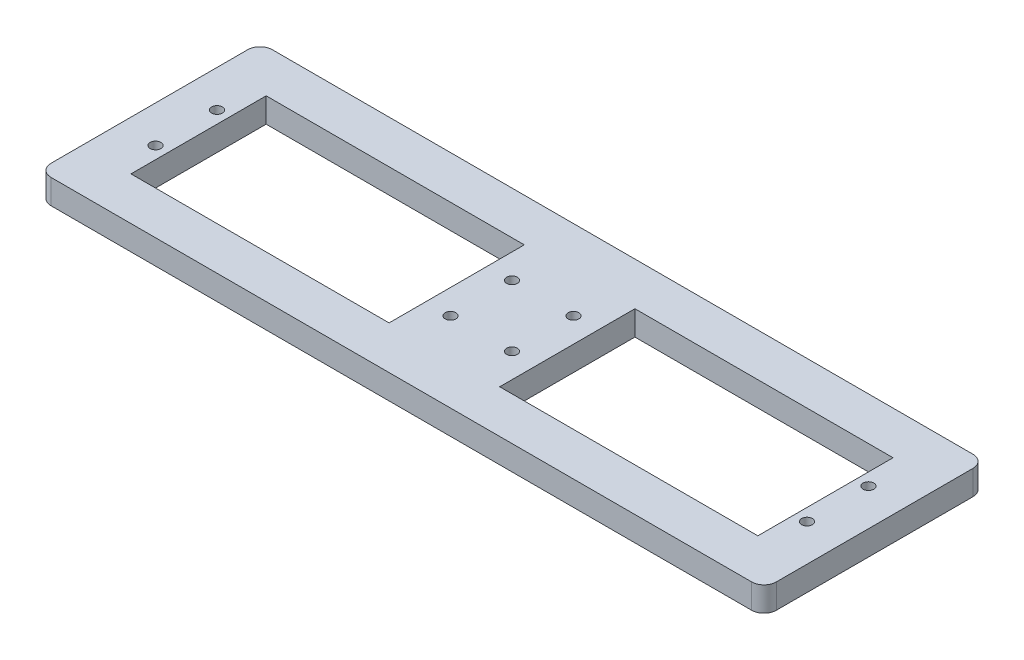
ISO-10303-21;
HEADER;
FILE_DESCRIPTION(('STEP AP214'),'2;1');
FILE_NAME('part.step','',(''),(''),'','','');
FILE_SCHEMA(('AUTOMOTIVE_DESIGN { 1 0 10303 214 1 1 1 1 }'));
ENDSEC;
DATA;
#1=APPLICATION_CONTEXT('core data for automotive mechanical design processes');
#2=APPLICATION_PROTOCOL_DEFINITION('international standard','automotive_design',2000,#1);
#3=PRODUCT_CONTEXT('',#1,'mechanical');
#4=PRODUCT('Part','Part','',(#3));
#5=PRODUCT_RELATED_PRODUCT_CATEGORY('part','',(#4));
#6=PRODUCT_DEFINITION_FORMATION('','',#4);
#7=PRODUCT_DEFINITION_CONTEXT('part definition',#1,'design');
#8=PRODUCT_DEFINITION('design','',#6,#7);
#9=PRODUCT_DEFINITION_SHAPE('','',#8);
#10=(LENGTH_UNIT() NAMED_UNIT(*) SI_UNIT(.MILLI.,.METRE.));
#11=(NAMED_UNIT(*) PLANE_ANGLE_UNIT() SI_UNIT($,.RADIAN.));
#12=(NAMED_UNIT(*) SI_UNIT($,.STERADIAN.) SOLID_ANGLE_UNIT());
#13=UNCERTAINTY_MEASURE_WITH_UNIT(LENGTH_MEASURE(1.E-05),#10,'distance_accuracy_value','');
#14=(GEOMETRIC_REPRESENTATION_CONTEXT(3) GLOBAL_UNCERTAINTY_ASSIGNED_CONTEXT((#13)) GLOBAL_UNIT_ASSIGNED_CONTEXT((#10,
#11,#12)) REPRESENTATION_CONTEXT('',''));
#15=CARTESIAN_POINT('',(0.,0.,0.));
#16=DIRECTION('',(0.,0.,1.));
#17=DIRECTION('',(1.,0.,0.));
#18=AXIS2_PLACEMENT_3D('',#15,#16,#17);
#19=CARTESIAN_POINT('',(57.,4.,16.));
#20=DIRECTION('',(0.,1.,0.));
#21=DIRECTION('',(0.,0.,1.));
#22=AXIS2_PLACEMENT_3D('',#19,#20,#21);
#23=PLANE('',#22);
#24=CARTESIAN_POINT('',(5.00000000000002,4.,4.99999999999999));
#25=DIRECTION('',(0.,1.,0.));
#26=DIRECTION('',(0.,0.,1.));
#27=AXIS2_PLACEMENT_3D('',#24,#25,#26);
#28=CIRCLE('',#27,0.875);
#29=CARTESIAN_POINT('',(5.00000000000002,4.,5.87499999999999));
#30=VERTEX_POINT('',#29);
#31=EDGE_CURVE('E464',#30,#30,#28,.F.);
#32=ORIENTED_EDGE('',*,*,#31,.T.);
#33=EDGE_LOOP('',(#32));
#34=FACE_BOUND('',#33,.T.);
#35=CARTESIAN_POINT('',(5.00000000000002,4.,-5.00000000000001));
#36=DIRECTION('',(0.,1.,0.));
#37=DIRECTION('',(0.,0.,1.));
#38=AXIS2_PLACEMENT_3D('',#35,#36,#37);
#39=CIRCLE('',#38,0.875);
#40=CARTESIAN_POINT('',(5.00000000000002,4.,-4.12500000000001));
#41=VERTEX_POINT('',#40);
#42=EDGE_CURVE('E469',#41,#41,#39,.F.);
#43=ORIENTED_EDGE('',*,*,#42,.T.);
#44=EDGE_LOOP('',(#43));
#45=FACE_BOUND('',#44,.T.);
#46=CARTESIAN_POINT('',(53.,4.,4.99999999999999));
#47=DIRECTION('',(0.,1.,0.));
#48=DIRECTION('',(0.,0.,1.));
#49=AXIS2_PLACEMENT_3D('',#46,#47,#48);
#50=CIRCLE('',#49,0.874999999999998);
#51=CARTESIAN_POINT('',(53.,4.,5.87499999999999));
#52=VERTEX_POINT('',#51);
#53=EDGE_CURVE('E493',#52,#52,#50,.F.);
#54=ORIENTED_EDGE('',*,*,#53,.T.);
#55=EDGE_LOOP('',(#54));
#56=FACE_BOUND('',#55,.T.);
#57=CARTESIAN_POINT('',(53.,4.,-5.00000000000001));
#58=DIRECTION('',(0.,1.,0.));
#59=DIRECTION('',(0.,0.,1.));
#60=AXIS2_PLACEMENT_3D('',#57,#58,#59);
#61=CIRCLE('',#60,0.874999999999998);
#62=CARTESIAN_POINT('',(53.,4.,-4.12500000000001));
#63=VERTEX_POINT('',#62);
#64=EDGE_CURVE('E486',#63,#63,#61,.F.);
#65=ORIENTED_EDGE('',*,*,#64,.T.);
#66=EDGE_LOOP('',(#65));
#67=FACE_BOUND('',#66,.T.);
#68=CARTESIAN_POINT('',(-5.00000000000002,4.,4.99999999999999));
#69=DIRECTION('',(0.,1.,0.));
#70=DIRECTION('',(0.,0.,1.));
#71=AXIS2_PLACEMENT_3D('',#68,#69,#70);
#72=CIRCLE('',#71,0.875);
#73=CARTESIAN_POINT('',(-5.00000000000002,4.,5.87499999999999));
#74=VERTEX_POINT('',#73);
#75=EDGE_CURVE('E509',#74,#74,#72,.T.);
#76=ORIENTED_EDGE('',*,*,#75,.F.);
#77=EDGE_LOOP('',(#76));
#78=FACE_BOUND('',#77,.T.);
#79=CARTESIAN_POINT('',(-5.00000000000002,4.,-5.00000000000001));
#80=DIRECTION('',(0.,1.,0.));
#81=DIRECTION('',(0.,0.,1.));
#82=AXIS2_PLACEMENT_3D('',#79,#80,#81);
#83=CIRCLE('',#82,0.875);
#84=CARTESIAN_POINT('',(-5.00000000000002,4.,-4.12500000000001));
#85=VERTEX_POINT('',#84);
#86=EDGE_CURVE('E502',#85,#85,#83,.T.);
#87=ORIENTED_EDGE('',*,*,#86,.F.);
#88=EDGE_LOOP('',(#87));
#89=FACE_BOUND('',#88,.T.);
#90=CARTESIAN_POINT('',(-53.,4.,4.99999999999999));
#91=DIRECTION('',(0.,1.,0.));
#92=DIRECTION('',(0.,0.,1.));
#93=AXIS2_PLACEMENT_3D('',#90,#91,#92);
#94=CIRCLE('',#93,0.874999999999998);
#95=CARTESIAN_POINT('',(-53.,4.,5.87499999999999));
#96=VERTEX_POINT('',#95);
#97=EDGE_CURVE('E190',#96,#96,#94,.T.);
#98=ORIENTED_EDGE('',*,*,#97,.F.);
#99=EDGE_LOOP('',(#98));
#100=FACE_BOUND('',#99,.T.);
#101=CARTESIAN_POINT('',(-53.,4.,-5.00000000000001));
#102=DIRECTION('',(0.,1.,0.));
#103=DIRECTION('',(0.,0.,1.));
#104=AXIS2_PLACEMENT_3D('',#101,#102,#103);
#105=CIRCLE('',#104,0.874999999999998);
#106=CARTESIAN_POINT('',(-53.,4.,-4.12500000000001));
#107=VERTEX_POINT('',#106);
#108=EDGE_CURVE('E518',#107,#107,#105,.T.);
#109=ORIENTED_EDGE('',*,*,#108,.F.);
#110=EDGE_LOOP('',(#109));
#111=FACE_BOUND('',#110,.T.);
#112=CARTESIAN_POINT('',(57.,4.,16.));
#113=DIRECTION('',(0.,1.,0.));
#114=DIRECTION('',(0.,0.,1.));
#115=AXIS2_PLACEMENT_3D('',#112,#113,#114);
#116=CIRCLE('',#115,2.);
#117=CARTESIAN_POINT('',(57.,4.,18.));
#118=VERTEX_POINT('',#117);
#119=CARTESIAN_POINT('',(59.,4.,16.));
#120=VERTEX_POINT('',#119);
#121=EDGE_CURVE('E249',#118,#120,#116,.T.);
#122=ORIENTED_EDGE('',*,*,#121,.T.);
#123=DIRECTION('',(0.,0.,-1.));
#124=VECTOR('',#123,1.);
#125=CARTESIAN_POINT('',(59.,4.,-16.));
#126=LINE('',#125,#124);
#127=CARTESIAN_POINT('',(59.,4.,-16.));
#128=VERTEX_POINT('',#127);
#129=EDGE_CURVE('E253',#120,#128,#126,.T.);
#130=ORIENTED_EDGE('',*,*,#129,.T.);
#131=CARTESIAN_POINT('',(57.,4.,-16.));
#132=DIRECTION('',(0.,1.,0.));
#133=DIRECTION('',(0.,0.,-1.));
#134=AXIS2_PLACEMENT_3D('',#131,#132,#133);
#135=CIRCLE('',#134,2.);
#136=CARTESIAN_POINT('',(57.,4.,-18.));
#137=VERTEX_POINT('',#136);
#138=EDGE_CURVE('E257',#128,#137,#135,.T.);
#139=ORIENTED_EDGE('',*,*,#138,.T.);
#140=DIRECTION('',(-1.,0.,0.));
#141=VECTOR('',#140,1.);
#142=CARTESIAN_POINT('',(-57.,4.,-18.));
#143=LINE('',#142,#141);
#144=CARTESIAN_POINT('',(-57.,4.,-18.));
#145=VERTEX_POINT('',#144);
#146=EDGE_CURVE('E260',#137,#145,#143,.T.);
#147=ORIENTED_EDGE('',*,*,#146,.T.);
#148=CARTESIAN_POINT('',(-57.,4.,-16.));
#149=DIRECTION('',(0.,1.,0.));
#150=DIRECTION('',(0.,0.,1.));
#151=AXIS2_PLACEMENT_3D('',#148,#149,#150);
#152=CIRCLE('',#151,2.);
#153=CARTESIAN_POINT('',(-59.,4.,-16.));
#154=VERTEX_POINT('',#153);
#155=EDGE_CURVE('E263',#145,#154,#152,.T.);
#156=ORIENTED_EDGE('',*,*,#155,.T.);
#157=DIRECTION('',(0.,0.,1.));
#158=VECTOR('',#157,1.);
#159=CARTESIAN_POINT('',(-59.,4.,-16.));
#160=LINE('',#159,#158);
#161=CARTESIAN_POINT('',(-59.,4.,16.));
#162=VERTEX_POINT('',#161);
#163=EDGE_CURVE('E266',#154,#162,#160,.T.);
#164=ORIENTED_EDGE('',*,*,#163,.T.);
#165=CARTESIAN_POINT('',(-57.,4.,16.));
#166=DIRECTION('',(0.,1.,0.));
#167=DIRECTION('',(0.,0.,1.));
#168=AXIS2_PLACEMENT_3D('',#165,#166,#167);
#169=CIRCLE('',#168,2.);
#170=CARTESIAN_POINT('',(-57.,4.,18.));
#171=VERTEX_POINT('',#170);
#172=EDGE_CURVE('E269',#162,#171,#169,.T.);
#173=ORIENTED_EDGE('',*,*,#172,.T.);
#174=DIRECTION('',(1.,0.,0.));
#175=VECTOR('',#174,1.);
#176=CARTESIAN_POINT('',(-57.,4.,18.));
#177=LINE('',#176,#175);
#178=EDGE_CURVE('E272',#171,#118,#177,.T.);
#179=ORIENTED_EDGE('',*,*,#178,.T.);
#180=EDGE_LOOP('',(#122,#130,#139,#147,#156,#164,#173,#179));
#181=FACE_BOUND('',#180,.T.);
#182=DIRECTION('',(-1.,0.,0.));
#183=VECTOR('',#182,1.);
#184=CARTESIAN_POINT('',(-51.,4.,-11.));
#185=LINE('',#184,#183);
#186=CARTESIAN_POINT('',(-9.00000000000001,4.,-11.));
#187=VERTEX_POINT('',#186);
#188=CARTESIAN_POINT('',(-51.,4.,-11.));
#189=VERTEX_POINT('',#188);
#190=EDGE_CURVE('E209',#187,#189,#185,.T.);
#191=ORIENTED_EDGE('',*,*,#190,.F.);
#192=DIRECTION('',(0.,0.,-1.));
#193=VECTOR('',#192,1.);
#194=CARTESIAN_POINT('',(-9.00000000000001,4.,-11.));
#195=LINE('',#194,#193);
#196=CARTESIAN_POINT('',(-9.00000000000001,4.,11.));
#197=VERTEX_POINT('',#196);
#198=EDGE_CURVE('E206',#197,#187,#195,.T.);
#199=ORIENTED_EDGE('',*,*,#198,.F.);
#200=DIRECTION('',(1.,0.,0.));
#201=VECTOR('',#200,1.);
#202=CARTESIAN_POINT('',(-51.,4.,11.));
#203=LINE('',#202,#201);
#204=CARTESIAN_POINT('',(-51.,4.,11.));
#205=VERTEX_POINT('',#204);
#206=EDGE_CURVE('E217',#205,#197,#203,.T.);
#207=ORIENTED_EDGE('',*,*,#206,.F.);
#208=DIRECTION('',(0.,0.,1.));
#209=VECTOR('',#208,1.);
#210=CARTESIAN_POINT('',(-51.,4.,-11.));
#211=LINE('',#210,#209);
#212=EDGE_CURVE('E213',#189,#205,#211,.T.);
#213=ORIENTED_EDGE('',*,*,#212,.F.);
#214=EDGE_LOOP('',(#191,#199,#207,#213));
#215=FACE_BOUND('',#214,.T.);
#216=DIRECTION('',(-1.,0.,0.));
#217=VECTOR('',#216,1.);
#218=CARTESIAN_POINT('',(51.,4.,-11.));
#219=LINE('',#218,#217);
#220=CARTESIAN_POINT('',(51.,4.,-11.));
#221=VERTEX_POINT('',#220);
#222=CARTESIAN_POINT('',(9.00000000000002,4.,-11.));
#223=VERTEX_POINT('',#222);
#224=EDGE_CURVE('E165',#221,#223,#219,.T.);
#225=ORIENTED_EDGE('',*,*,#224,.F.);
#226=DIRECTION('',(0.,0.,-1.));
#227=VECTOR('',#226,1.);
#228=CARTESIAN_POINT('',(51.,4.,-11.));
#229=LINE('',#228,#227);
#230=CARTESIAN_POINT('',(51.,4.,11.));
#231=VERTEX_POINT('',#230);
#232=EDGE_CURVE('E156',#231,#221,#229,.T.);
#233=ORIENTED_EDGE('',*,*,#232,.F.);
#234=DIRECTION('',(1.,0.,0.));
#235=VECTOR('',#234,1.);
#236=CARTESIAN_POINT('',(51.,4.,11.));
#237=LINE('',#236,#235);
#238=CARTESIAN_POINT('',(9.00000000000003,4.,11.));
#239=VERTEX_POINT('',#238);
#240=EDGE_CURVE('E182',#239,#231,#237,.T.);
#241=ORIENTED_EDGE('',*,*,#240,.F.);
#242=DIRECTION('',(0.,0.,1.));
#243=VECTOR('',#242,1.);
#244=CARTESIAN_POINT('',(9.00000000000002,4.,-11.));
#245=LINE('',#244,#243);
#246=EDGE_CURVE('E178',#223,#239,#245,.T.);
#247=ORIENTED_EDGE('',*,*,#246,.F.);
#248=EDGE_LOOP('',(#225,#233,#241,#247));
#249=FACE_BOUND('',#248,.T.);
#250=ADVANCED_FACE('F42',(#34,#45,#56,#67,#78,#89,#100,#111,#181,#215,#249),#23,.T.);
#251=CARTESIAN_POINT('',(57.,0.,16.));
#252=DIRECTION('',(0.,1.,0.));
#253=DIRECTION('',(0.,0.,1.));
#254=AXIS2_PLACEMENT_3D('',#251,#252,#253);
#255=PLANE('',#254);
#256=CARTESIAN_POINT('',(5.00000000000002,0.,4.99999999999999));
#257=DIRECTION('',(0.,1.,0.));
#258=DIRECTION('',(0.,0.,-1.));
#259=AXIS2_PLACEMENT_3D('',#256,#257,#258);
#260=CIRCLE('',#259,0.875);
#261=CARTESIAN_POINT('',(5.00000000000002,0.,4.12499999999999));
#262=VERTEX_POINT('',#261);
#263=EDGE_CURVE('E467',#262,#262,#260,.T.);
#264=ORIENTED_EDGE('',*,*,#263,.T.);
#265=EDGE_LOOP('',(#264));
#266=FACE_BOUND('',#265,.T.);
#267=CARTESIAN_POINT('',(5.00000000000002,0.,-5.00000000000001));
#268=DIRECTION('',(0.,1.,0.));
#269=DIRECTION('',(0.,0.,-1.));
#270=AXIS2_PLACEMENT_3D('',#267,#268,#269);
#271=CIRCLE('',#270,0.875);
#272=CARTESIAN_POINT('',(5.00000000000002,0.,-5.87500000000001));
#273=VERTEX_POINT('',#272);
#274=EDGE_CURVE('E470',#273,#273,#271,.T.);
#275=ORIENTED_EDGE('',*,*,#274,.T.);
#276=EDGE_LOOP('',(#275));
#277=FACE_BOUND('',#276,.T.);
#278=CARTESIAN_POINT('',(53.,0.,4.99999999999999));
#279=DIRECTION('',(0.,1.,0.));
#280=DIRECTION('',(0.,0.,-1.));
#281=AXIS2_PLACEMENT_3D('',#278,#279,#280);
#282=CIRCLE('',#281,0.874999999999998);
#283=CARTESIAN_POINT('',(53.,0.,4.12499999999999));
#284=VERTEX_POINT('',#283);
#285=EDGE_CURVE('E482',#284,#284,#282,.T.);
#286=ORIENTED_EDGE('',*,*,#285,.T.);
#287=EDGE_LOOP('',(#286));
#288=FACE_BOUND('',#287,.T.);
#289=CARTESIAN_POINT('',(53.,0.,-5.00000000000001));
#290=DIRECTION('',(0.,1.,0.));
#291=DIRECTION('',(0.,0.,-1.));
#292=AXIS2_PLACEMENT_3D('',#289,#290,#291);
#293=CIRCLE('',#292,0.874999999999998);
#294=CARTESIAN_POINT('',(53.,0.,-5.87500000000001));
#295=VERTEX_POINT('',#294);
#296=EDGE_CURVE('E481',#295,#295,#293,.T.);
#297=ORIENTED_EDGE('',*,*,#296,.T.);
#298=EDGE_LOOP('',(#297));
#299=FACE_BOUND('',#298,.T.);
#300=CARTESIAN_POINT('',(-5.00000000000002,0.,4.99999999999999));
#301=DIRECTION('',(0.,-1.,0.));
#302=DIRECTION('',(0.,0.,-1.));
#303=AXIS2_PLACEMENT_3D('',#300,#301,#302);
#304=CIRCLE('',#303,0.875);
#305=CARTESIAN_POINT('',(-5.00000000000002,0.,4.12499999999999));
#306=VERTEX_POINT('',#305);
#307=EDGE_CURVE('E498',#306,#306,#304,.T.);
#308=ORIENTED_EDGE('',*,*,#307,.F.);
#309=EDGE_LOOP('',(#308));
#310=FACE_BOUND('',#309,.T.);
#311=CARTESIAN_POINT('',(-5.00000000000002,0.,-5.00000000000001));
#312=DIRECTION('',(0.,-1.,0.));
#313=DIRECTION('',(0.,0.,-1.));
#314=AXIS2_PLACEMENT_3D('',#311,#312,#313);
#315=CIRCLE('',#314,0.875);
#316=CARTESIAN_POINT('',(-5.00000000000002,0.,-5.87500000000001));
#317=VERTEX_POINT('',#316);
#318=EDGE_CURVE('E497',#317,#317,#315,.T.);
#319=ORIENTED_EDGE('',*,*,#318,.F.);
#320=EDGE_LOOP('',(#319));
#321=FACE_BOUND('',#320,.T.);
#322=CARTESIAN_POINT('',(-53.,0.,4.99999999999999));
#323=DIRECTION('',(0.,-1.,0.));
#324=DIRECTION('',(0.,0.,-1.));
#325=AXIS2_PLACEMENT_3D('',#322,#323,#324);
#326=CIRCLE('',#325,0.874999999999998);
#327=CARTESIAN_POINT('',(-53.,0.,4.12499999999999));
#328=VERTEX_POINT('',#327);
#329=EDGE_CURVE('E514',#328,#328,#326,.T.);
#330=ORIENTED_EDGE('',*,*,#329,.F.);
#331=EDGE_LOOP('',(#330));
#332=FACE_BOUND('',#331,.T.);
#333=CARTESIAN_POINT('',(-53.,0.,-5.00000000000001));
#334=DIRECTION('',(0.,-1.,0.));
#335=DIRECTION('',(0.,0.,-1.));
#336=AXIS2_PLACEMENT_3D('',#333,#334,#335);
#337=CIRCLE('',#336,0.874999999999998);
#338=CARTESIAN_POINT('',(-53.,0.,-5.87500000000001));
#339=VERTEX_POINT('',#338);
#340=EDGE_CURVE('E513',#339,#339,#337,.T.);
#341=ORIENTED_EDGE('',*,*,#340,.F.);
#342=EDGE_LOOP('',(#341));
#343=FACE_BOUND('',#342,.T.);
#344=DIRECTION('',(0.,0.,-1.));
#345=VECTOR('',#344,1.);
#346=CARTESIAN_POINT('',(-9.00000000000001,0.,-11.));
#347=LINE('',#346,#345);
#348=CARTESIAN_POINT('',(-9.00000000000001,0.,11.));
#349=VERTEX_POINT('',#348);
#350=CARTESIAN_POINT('',(-9.00000000000001,0.,-11.));
#351=VERTEX_POINT('',#350);
#352=EDGE_CURVE('E174',#349,#351,#347,.T.);
#353=ORIENTED_EDGE('',*,*,#352,.T.);
#354=DIRECTION('',(-1.,0.,0.));
#355=VECTOR('',#354,1.);
#356=CARTESIAN_POINT('',(-51.,0.,-11.));
#357=LINE('',#356,#355);
#358=CARTESIAN_POINT('',(-51.,0.,-11.));
#359=VERTEX_POINT('',#358);
#360=EDGE_CURVE('E224',#351,#359,#357,.T.);
#361=ORIENTED_EDGE('',*,*,#360,.T.);
#362=DIRECTION('',(0.,0.,1.));
#363=VECTOR('',#362,1.);
#364=CARTESIAN_POINT('',(-51.,0.,-11.));
#365=LINE('',#364,#363);
#366=CARTESIAN_POINT('',(-51.,0.,11.));
#367=VERTEX_POINT('',#366);
#368=EDGE_CURVE('E228',#359,#367,#365,.T.);
#369=ORIENTED_EDGE('',*,*,#368,.T.);
#370=DIRECTION('',(1.,0.,0.));
#371=VECTOR('',#370,1.);
#372=CARTESIAN_POINT('',(-51.,0.,11.));
#373=LINE('',#372,#371);
#374=EDGE_CURVE('E210',#367,#349,#373,.T.);
#375=ORIENTED_EDGE('',*,*,#374,.T.);
#376=EDGE_LOOP('',(#353,#361,#369,#375));
#377=FACE_BOUND('',#376,.T.);
#378=CARTESIAN_POINT('',(57.,0.,16.));
#379=DIRECTION('',(0.,1.,0.));
#380=DIRECTION('',(0.,0.,1.));
#381=AXIS2_PLACEMENT_3D('',#378,#379,#380);
#382=CIRCLE('',#381,2.);
#383=CARTESIAN_POINT('',(57.,0.,18.));
#384=VERTEX_POINT('',#383);
#385=CARTESIAN_POINT('',(59.,0.,16.));
#386=VERTEX_POINT('',#385);
#387=EDGE_CURVE('E248',#384,#386,#382,.T.);
#388=ORIENTED_EDGE('',*,*,#387,.F.);
#389=DIRECTION('',(1.,0.,0.));
#390=VECTOR('',#389,1.);
#391=CARTESIAN_POINT('',(-57.,0.,18.));
#392=LINE('',#391,#390);
#393=CARTESIAN_POINT('',(-57.,0.,18.));
#394=VERTEX_POINT('',#393);
#395=EDGE_CURVE('E254',#394,#384,#392,.T.);
#396=ORIENTED_EDGE('',*,*,#395,.F.);
#397=CARTESIAN_POINT('',(-57.,0.,16.));
#398=DIRECTION('',(0.,1.,0.));
#399=DIRECTION('',(0.,0.,1.));
#400=AXIS2_PLACEMENT_3D('',#397,#398,#399);
#401=CIRCLE('',#400,2.);
#402=CARTESIAN_POINT('',(-59.,0.,16.));
#403=VERTEX_POINT('',#402);
#404=EDGE_CURVE('E294',#403,#394,#401,.T.);
#405=ORIENTED_EDGE('',*,*,#404,.F.);
#406=DIRECTION('',(0.,0.,1.));
#407=VECTOR('',#406,1.);
#408=CARTESIAN_POINT('',(-59.,0.,-16.));
#409=LINE('',#408,#407);
#410=CARTESIAN_POINT('',(-59.,0.,-16.));
#411=VERTEX_POINT('',#410);
#412=EDGE_CURVE('E291',#411,#403,#409,.T.);
#413=ORIENTED_EDGE('',*,*,#412,.F.);
#414=CARTESIAN_POINT('',(-57.,0.,-16.));
#415=DIRECTION('',(0.,1.,0.));
#416=DIRECTION('',(0.,0.,1.));
#417=AXIS2_PLACEMENT_3D('',#414,#415,#416);
#418=CIRCLE('',#417,2.);
#419=CARTESIAN_POINT('',(-57.,0.,-18.));
#420=VERTEX_POINT('',#419);
#421=EDGE_CURVE('E288',#420,#411,#418,.T.);
#422=ORIENTED_EDGE('',*,*,#421,.F.);
#423=DIRECTION('',(-1.,0.,0.));
#424=VECTOR('',#423,1.);
#425=CARTESIAN_POINT('',(-57.,0.,-18.));
#426=LINE('',#425,#424);
#427=CARTESIAN_POINT('',(57.,0.,-18.));
#428=VERTEX_POINT('',#427);
#429=EDGE_CURVE('E285',#428,#420,#426,.T.);
#430=ORIENTED_EDGE('',*,*,#429,.F.);
#431=CARTESIAN_POINT('',(57.,0.,-16.));
#432=DIRECTION('',(0.,1.,0.));
#433=DIRECTION('',(0.,0.,-1.));
#434=AXIS2_PLACEMENT_3D('',#431,#432,#433);
#435=CIRCLE('',#434,2.);
#436=CARTESIAN_POINT('',(59.,0.,-16.));
#437=VERTEX_POINT('',#436);
#438=EDGE_CURVE('E282',#437,#428,#435,.T.);
#439=ORIENTED_EDGE('',*,*,#438,.F.);
#440=DIRECTION('',(0.,0.,-1.));
#441=VECTOR('',#440,1.);
#442=CARTESIAN_POINT('',(59.,0.,-16.));
#443=LINE('',#442,#441);
#444=EDGE_CURVE('E279',#386,#437,#443,.T.);
#445=ORIENTED_EDGE('',*,*,#444,.F.);
#446=EDGE_LOOP('',(#388,#396,#405,#413,#422,#430,#439,#445));
#447=FACE_BOUND('',#446,.T.);
#448=DIRECTION('',(0.,0.,-1.));
#449=VECTOR('',#448,1.);
#450=CARTESIAN_POINT('',(51.,0.,-11.));
#451=LINE('',#450,#449);
#452=CARTESIAN_POINT('',(51.,0.,11.));
#453=VERTEX_POINT('',#452);
#454=CARTESIAN_POINT('',(51.,0.,-11.));
#455=VERTEX_POINT('',#454);
#456=EDGE_CURVE('E66',#453,#455,#451,.T.);
#457=ORIENTED_EDGE('',*,*,#456,.T.);
#458=DIRECTION('',(-1.,0.,0.));
#459=VECTOR('',#458,1.);
#460=CARTESIAN_POINT('',(51.,0.,-11.));
#461=LINE('',#460,#459);
#462=CARTESIAN_POINT('',(9.00000000000002,0.,-11.));
#463=VERTEX_POINT('',#462);
#464=EDGE_CURVE('E172',#455,#463,#461,.T.);
#465=ORIENTED_EDGE('',*,*,#464,.T.);
#466=DIRECTION('',(0.,0.,1.));
#467=VECTOR('',#466,1.);
#468=CARTESIAN_POINT('',(9.00000000000002,0.,-11.));
#469=LINE('',#468,#467);
#470=CARTESIAN_POINT('',(9.00000000000002,0.,11.));
#471=VERTEX_POINT('',#470);
#472=EDGE_CURVE('E193',#463,#471,#469,.T.);
#473=ORIENTED_EDGE('',*,*,#472,.T.);
#474=DIRECTION('',(1.,0.,0.));
#475=VECTOR('',#474,1.);
#476=CARTESIAN_POINT('',(51.,0.,11.));
#477=LINE('',#476,#475);
#478=EDGE_CURVE('E166',#471,#453,#477,.T.);
#479=ORIENTED_EDGE('',*,*,#478,.T.);
#480=EDGE_LOOP('',(#457,#465,#473,#479));
#481=FACE_BOUND('',#480,.T.);
#482=ADVANCED_FACE('F333',(#266,#277,#288,#299,#310,#321,#332,#343,#377,#447,#481),#255,.F.);
#483=CARTESIAN_POINT('',(57.,4.,16.));
#484=DIRECTION('',(0.,-1.,0.));
#485=DIRECTION('',(0.,0.,-1.));
#486=AXIS2_PLACEMENT_3D('',#483,#484,#485);
#487=CYLINDRICAL_SURFACE('',#486,2.);
#488=ORIENTED_EDGE('',*,*,#387,.T.);
#489=DIRECTION('',(0.,-1.,0.));
#490=VECTOR('',#489,1.);
#491=CARTESIAN_POINT('',(59.,4.,16.));
#492=LINE('',#491,#490);
#493=EDGE_CURVE('E11',#120,#386,#492,.T.);
#494=ORIENTED_EDGE('',*,*,#493,.F.);
#495=ORIENTED_EDGE('',*,*,#121,.F.);
#496=DIRECTION('',(0.,-1.,0.));
#497=VECTOR('',#496,1.);
#498=CARTESIAN_POINT('',(57.,4.,18.));
#499=LINE('',#498,#497);
#500=EDGE_CURVE('E275',#118,#384,#499,.T.);
#501=ORIENTED_EDGE('',*,*,#500,.T.);
#502=EDGE_LOOP('',(#488,#494,#495,#501));
#503=FACE_BOUND('',#502,.T.);
#504=ADVANCED_FACE('F44',(#503),#487,.T.);
#505=CARTESIAN_POINT('',(59.,4.,-16.));
#506=DIRECTION('',(-1.,0.,0.));
#507=DIRECTION('',(0.,0.,1.));
#508=AXIS2_PLACEMENT_3D('',#505,#506,#507);
#509=PLANE('',#508);
#510=ORIENTED_EDGE('',*,*,#444,.T.);
#511=DIRECTION('',(0.,-1.,0.));
#512=VECTOR('',#511,1.);
#513=CARTESIAN_POINT('',(59.,4.,-16.));
#514=LINE('',#513,#512);
#515=EDGE_CURVE('E51',#128,#437,#514,.T.);
#516=ORIENTED_EDGE('',*,*,#515,.F.);
#517=ORIENTED_EDGE('',*,*,#129,.F.);
#518=ORIENTED_EDGE('',*,*,#493,.T.);
#519=EDGE_LOOP('',(#510,#516,#517,#518));
#520=FACE_BOUND('',#519,.T.);
#521=ADVANCED_FACE('F351',(#520),#509,.F.);
#522=CARTESIAN_POINT('',(57.,4.,-16.));
#523=DIRECTION('',(0.,-1.,0.));
#524=DIRECTION('',(0.,0.,-1.));
#525=AXIS2_PLACEMENT_3D('',#522,#523,#524);
#526=CYLINDRICAL_SURFACE('',#525,2.);
#527=ORIENTED_EDGE('',*,*,#438,.T.);
#528=DIRECTION('',(0.,-1.,0.));
#529=VECTOR('',#528,1.);
#530=CARTESIAN_POINT('',(57.,4.,-18.));
#531=LINE('',#530,#529);
#532=EDGE_CURVE('E318',#137,#428,#531,.T.);
#533=ORIENTED_EDGE('',*,*,#532,.F.);
#534=ORIENTED_EDGE('',*,*,#138,.F.);
#535=ORIENTED_EDGE('',*,*,#515,.T.);
#536=EDGE_LOOP('',(#527,#533,#534,#535));
#537=FACE_BOUND('',#536,.T.);
#538=ADVANCED_FACE('F327',(#537),#526,.T.);
#539=CARTESIAN_POINT('',(-57.,4.,-18.));
#540=DIRECTION('',(0.,0.,1.));
#541=DIRECTION('',(1.,0.,0.));
#542=AXIS2_PLACEMENT_3D('',#539,#540,#541);
#543=PLANE('',#542);
#544=ORIENTED_EDGE('',*,*,#429,.T.);
#545=DIRECTION('',(0.,-1.,0.));
#546=VECTOR('',#545,1.);
#547=CARTESIAN_POINT('',(-57.,4.,-18.));
#548=LINE('',#547,#546);
#549=EDGE_CURVE('E314',#145,#420,#548,.T.);
#550=ORIENTED_EDGE('',*,*,#549,.F.);
#551=ORIENTED_EDGE('',*,*,#146,.F.);
#552=ORIENTED_EDGE('',*,*,#532,.T.);
#553=EDGE_LOOP('',(#544,#550,#551,#552));
#554=FACE_BOUND('',#553,.T.);
#555=ADVANCED_FACE('F339',(#554),#543,.F.);
#556=CARTESIAN_POINT('',(-57.,4.,-16.));
#557=DIRECTION('',(0.,-1.,0.));
#558=DIRECTION('',(0.,0.,-1.));
#559=AXIS2_PLACEMENT_3D('',#556,#557,#558);
#560=CYLINDRICAL_SURFACE('',#559,2.);
#561=ORIENTED_EDGE('',*,*,#421,.T.);
#562=DIRECTION('',(0.,-1.,0.));
#563=VECTOR('',#562,1.);
#564=CARTESIAN_POINT('',(-59.,4.,-16.));
#565=LINE('',#564,#563);
#566=EDGE_CURVE('E310',#154,#411,#565,.T.);
#567=ORIENTED_EDGE('',*,*,#566,.F.);
#568=ORIENTED_EDGE('',*,*,#155,.F.);
#569=ORIENTED_EDGE('',*,*,#549,.T.);
#570=EDGE_LOOP('',(#561,#567,#568,#569));
#571=FACE_BOUND('',#570,.T.);
#572=ADVANCED_FACE('F343',(#571),#560,.T.);
#573=CARTESIAN_POINT('',(-59.,4.,-16.));
#574=DIRECTION('',(1.,0.,0.));
#575=DIRECTION('',(0.,0.,-1.));
#576=AXIS2_PLACEMENT_3D('',#573,#574,#575);
#577=PLANE('',#576);
#578=ORIENTED_EDGE('',*,*,#412,.T.);
#579=DIRECTION('',(0.,-1.,0.));
#580=VECTOR('',#579,1.);
#581=CARTESIAN_POINT('',(-59.,4.,16.));
#582=LINE('',#581,#580);
#583=EDGE_CURVE('E306',#162,#403,#582,.T.);
#584=ORIENTED_EDGE('',*,*,#583,.F.);
#585=ORIENTED_EDGE('',*,*,#163,.F.);
#586=ORIENTED_EDGE('',*,*,#566,.T.);
#587=EDGE_LOOP('',(#578,#584,#585,#586));
#588=FACE_BOUND('',#587,.T.);
#589=ADVANCED_FACE('F364',(#588),#577,.F.);
#590=CARTESIAN_POINT('',(-57.,4.,16.));
#591=DIRECTION('',(0.,-1.,0.));
#592=DIRECTION('',(0.,0.,-1.));
#593=AXIS2_PLACEMENT_3D('',#590,#591,#592);
#594=CYLINDRICAL_SURFACE('',#593,2.);
#595=ORIENTED_EDGE('',*,*,#404,.T.);
#596=DIRECTION('',(0.,-1.,0.));
#597=VECTOR('',#596,1.);
#598=CARTESIAN_POINT('',(-57.,4.,18.));
#599=LINE('',#598,#597);
#600=EDGE_CURVE('E302',#171,#394,#599,.T.);
#601=ORIENTED_EDGE('',*,*,#600,.F.);
#602=ORIENTED_EDGE('',*,*,#172,.F.);
#603=ORIENTED_EDGE('',*,*,#583,.T.);
#604=EDGE_LOOP('',(#595,#601,#602,#603));
#605=FACE_BOUND('',#604,.T.);
#606=ADVANCED_FACE('F362',(#605),#594,.T.);
#607=CARTESIAN_POINT('',(-57.,4.,18.));
#608=DIRECTION('',(0.,0.,-1.));
#609=DIRECTION('',(-1.,0.,0.));
#610=AXIS2_PLACEMENT_3D('',#607,#608,#609);
#611=PLANE('',#610);
#612=ORIENTED_EDGE('',*,*,#395,.T.);
#613=ORIENTED_EDGE('',*,*,#500,.F.);
#614=ORIENTED_EDGE('',*,*,#178,.F.);
#615=ORIENTED_EDGE('',*,*,#600,.T.);
#616=EDGE_LOOP('',(#612,#613,#614,#615));
#617=FACE_BOUND('',#616,.T.);
#618=ADVANCED_FACE('F357',(#617),#611,.F.);
#619=CARTESIAN_POINT('',(-9.00000000000001,4.,-11.));
#620=DIRECTION('',(-1.,0.,0.));
#621=DIRECTION('',(0.,0.,1.));
#622=AXIS2_PLACEMENT_3D('',#619,#620,#621);
#623=PLANE('',#622);
#624=ORIENTED_EDGE('',*,*,#352,.F.);
#625=DIRECTION('',(0.,-1.,0.));
#626=VECTOR('',#625,1.);
#627=CARTESIAN_POINT('',(-9.00000000000001,4.,11.));
#628=LINE('',#627,#626);
#629=EDGE_CURVE('E220',#197,#349,#628,.T.);
#630=ORIENTED_EDGE('',*,*,#629,.F.);
#631=ORIENTED_EDGE('',*,*,#198,.T.);
#632=DIRECTION('',(0.,-1.,0.));
#633=VECTOR('',#632,1.);
#634=CARTESIAN_POINT('',(-9.00000000000001,4.,-11.));
#635=LINE('',#634,#633);
#636=EDGE_CURVE('E244',#187,#351,#635,.T.);
#637=ORIENTED_EDGE('',*,*,#636,.T.);
#638=EDGE_LOOP('',(#624,#630,#631,#637));
#639=FACE_BOUND('',#638,.T.);
#640=ADVANCED_FACE('F384',(#639),#623,.T.);
#641=CARTESIAN_POINT('',(-51.,4.,-11.));
#642=DIRECTION('',(0.,0.,1.));
#643=DIRECTION('',(1.,0.,0.));
#644=AXIS2_PLACEMENT_3D('',#641,#642,#643);
#645=PLANE('',#644);
#646=ORIENTED_EDGE('',*,*,#360,.F.);
#647=ORIENTED_EDGE('',*,*,#636,.F.);
#648=ORIENTED_EDGE('',*,*,#190,.T.);
#649=DIRECTION('',(0.,-1.,0.));
#650=VECTOR('',#649,1.);
#651=CARTESIAN_POINT('',(-51.,4.,-11.));
#652=LINE('',#651,#650);
#653=EDGE_CURVE('E241',#189,#359,#652,.T.);
#654=ORIENTED_EDGE('',*,*,#653,.T.);
#655=EDGE_LOOP('',(#646,#647,#648,#654));
#656=FACE_BOUND('',#655,.T.);
#657=ADVANCED_FACE('F391',(#656),#645,.T.);
#658=CARTESIAN_POINT('',(-51.,4.,-11.));
#659=DIRECTION('',(1.,0.,0.));
#660=DIRECTION('',(0.,0.,-1.));
#661=AXIS2_PLACEMENT_3D('',#658,#659,#660);
#662=PLANE('',#661);
#663=ORIENTED_EDGE('',*,*,#368,.F.);
#664=ORIENTED_EDGE('',*,*,#653,.F.);
#665=ORIENTED_EDGE('',*,*,#212,.T.);
#666=DIRECTION('',(0.,-1.,0.));
#667=VECTOR('',#666,1.);
#668=CARTESIAN_POINT('',(-51.,4.,11.));
#669=LINE('',#668,#667);
#670=EDGE_CURVE('E238',#205,#367,#669,.T.);
#671=ORIENTED_EDGE('',*,*,#670,.T.);
#672=EDGE_LOOP('',(#663,#664,#665,#671));
#673=FACE_BOUND('',#672,.T.);
#674=ADVANCED_FACE('F396',(#673),#662,.T.);
#675=CARTESIAN_POINT('',(-51.,4.,11.));
#676=DIRECTION('',(0.,0.,-1.));
#677=DIRECTION('',(-1.,0.,0.));
#678=AXIS2_PLACEMENT_3D('',#675,#676,#677);
#679=PLANE('',#678);
#680=ORIENTED_EDGE('',*,*,#374,.F.);
#681=ORIENTED_EDGE('',*,*,#670,.F.);
#682=ORIENTED_EDGE('',*,*,#206,.T.);
#683=ORIENTED_EDGE('',*,*,#629,.T.);
#684=EDGE_LOOP('',(#680,#681,#682,#683));
#685=FACE_BOUND('',#684,.T.);
#686=ADVANCED_FACE('F404',(#685),#679,.T.);
#687=CARTESIAN_POINT('',(51.,4.,-11.));
#688=DIRECTION('',(-1.,0.,0.));
#689=DIRECTION('',(0.,0.,1.));
#690=AXIS2_PLACEMENT_3D('',#687,#688,#689);
#691=PLANE('',#690);
#692=ORIENTED_EDGE('',*,*,#456,.F.);
#693=DIRECTION('',(0.,-1.,0.));
#694=VECTOR('',#693,1.);
#695=CARTESIAN_POINT('',(51.,4.,11.));
#696=LINE('',#695,#694);
#697=EDGE_CURVE('E160',#231,#453,#696,.T.);
#698=ORIENTED_EDGE('',*,*,#697,.F.);
#699=ORIENTED_EDGE('',*,*,#232,.T.);
#700=DIRECTION('',(0.,-1.,0.));
#701=VECTOR('',#700,1.);
#702=CARTESIAN_POINT('',(51.,4.,-11.));
#703=LINE('',#702,#701);
#704=EDGE_CURVE('E159',#221,#455,#703,.T.);
#705=ORIENTED_EDGE('',*,*,#704,.T.);
#706=EDGE_LOOP('',(#692,#698,#699,#705));
#707=FACE_BOUND('',#706,.T.);
#708=ADVANCED_FACE('F158',(#707),#691,.T.);
#709=CARTESIAN_POINT('',(51.,4.,-11.));
#710=DIRECTION('',(0.,0.,1.));
#711=DIRECTION('',(1.,0.,0.));
#712=AXIS2_PLACEMENT_3D('',#709,#710,#711);
#713=PLANE('',#712);
#714=ORIENTED_EDGE('',*,*,#464,.F.);
#715=ORIENTED_EDGE('',*,*,#704,.F.);
#716=ORIENTED_EDGE('',*,*,#224,.T.);
#717=DIRECTION('',(0.,-1.,0.));
#718=VECTOR('',#717,1.);
#719=CARTESIAN_POINT('',(9.00000000000002,4.,-11.));
#720=LINE('',#719,#718);
#721=EDGE_CURVE('E175',#223,#463,#720,.T.);
#722=ORIENTED_EDGE('',*,*,#721,.T.);
#723=EDGE_LOOP('',(#714,#715,#716,#722));
#724=FACE_BOUND('',#723,.T.);
#725=ADVANCED_FACE('F169',(#724),#713,.T.);
#726=CARTESIAN_POINT('',(9.00000000000002,4.,-11.));
#727=DIRECTION('',(1.,0.,0.));
#728=DIRECTION('',(0.,0.,-1.));
#729=AXIS2_PLACEMENT_3D('',#726,#727,#728);
#730=PLANE('',#729);
#731=ORIENTED_EDGE('',*,*,#472,.F.);
#732=ORIENTED_EDGE('',*,*,#721,.F.);
#733=ORIENTED_EDGE('',*,*,#246,.T.);
#734=DIRECTION('',(0.,-1.,0.));
#735=VECTOR('',#734,1.);
#736=CARTESIAN_POINT('',(9.00000000000002,4.,11.));
#737=LINE('',#736,#735);
#738=EDGE_CURVE('E58',#239,#471,#737,.T.);
#739=ORIENTED_EDGE('',*,*,#738,.T.);
#740=EDGE_LOOP('',(#731,#732,#733,#739));
#741=FACE_BOUND('',#740,.T.);
#742=ADVANCED_FACE('F422',(#741),#730,.T.);
#743=CARTESIAN_POINT('',(51.,4.,11.));
#744=DIRECTION('',(0.,0.,-1.));
#745=DIRECTION('',(-1.,0.,0.));
#746=AXIS2_PLACEMENT_3D('',#743,#744,#745);
#747=PLANE('',#746);
#748=ORIENTED_EDGE('',*,*,#478,.F.);
#749=ORIENTED_EDGE('',*,*,#738,.F.);
#750=ORIENTED_EDGE('',*,*,#240,.T.);
#751=ORIENTED_EDGE('',*,*,#697,.T.);
#752=EDGE_LOOP('',(#748,#749,#750,#751));
#753=FACE_BOUND('',#752,.T.);
#754=ADVANCED_FACE('F425',(#753),#747,.T.);
#755=CARTESIAN_POINT('',(-53.,10.,-5.00000000000001));
#756=DIRECTION('',(0.,-1.,0.));
#757=DIRECTION('',(0.,0.,-1.));
#758=AXIS2_PLACEMENT_3D('',#755,#756,#757);
#759=CYLINDRICAL_SURFACE('',#758,0.874999999999998);
#760=ORIENTED_EDGE('',*,*,#108,.T.);
#761=EDGE_LOOP('',(#760));
#762=FACE_BOUND('',#761,.T.);
#763=ORIENTED_EDGE('',*,*,#340,.T.);
#764=EDGE_LOOP('',(#763));
#765=FACE_BOUND('',#764,.T.);
#766=ADVANCED_FACE('F429',(#762,#765),#759,.F.);
#767=CARTESIAN_POINT('',(-53.,10.,4.99999999999999));
#768=DIRECTION('',(0.,-1.,0.));
#769=DIRECTION('',(0.,0.,-1.));
#770=AXIS2_PLACEMENT_3D('',#767,#768,#769);
#771=CYLINDRICAL_SURFACE('',#770,0.874999999999998);
#772=ORIENTED_EDGE('',*,*,#97,.T.);
#773=EDGE_LOOP('',(#772));
#774=FACE_BOUND('',#773,.T.);
#775=ORIENTED_EDGE('',*,*,#329,.T.);
#776=EDGE_LOOP('',(#775));
#777=FACE_BOUND('',#776,.T.);
#778=ADVANCED_FACE('F432',(#774,#777),#771,.F.);
#779=CARTESIAN_POINT('',(-5.00000000000002,10.,-5.00000000000001));
#780=DIRECTION('',(0.,-1.,0.));
#781=DIRECTION('',(0.,0.,-1.));
#782=AXIS2_PLACEMENT_3D('',#779,#780,#781);
#783=CYLINDRICAL_SURFACE('',#782,0.875);
#784=ORIENTED_EDGE('',*,*,#86,.T.);
#785=EDGE_LOOP('',(#784));
#786=FACE_BOUND('',#785,.T.);
#787=ORIENTED_EDGE('',*,*,#318,.T.);
#788=EDGE_LOOP('',(#787));
#789=FACE_BOUND('',#788,.T.);
#790=ADVANCED_FACE('F436',(#786,#789),#783,.F.);
#791=CARTESIAN_POINT('',(-5.00000000000002,10.,4.99999999999999));
#792=DIRECTION('',(0.,-1.,0.));
#793=DIRECTION('',(0.,0.,-1.));
#794=AXIS2_PLACEMENT_3D('',#791,#792,#793);
#795=CYLINDRICAL_SURFACE('',#794,0.875);
#796=ORIENTED_EDGE('',*,*,#75,.T.);
#797=EDGE_LOOP('',(#796));
#798=FACE_BOUND('',#797,.T.);
#799=ORIENTED_EDGE('',*,*,#307,.T.);
#800=EDGE_LOOP('',(#799));
#801=FACE_BOUND('',#800,.T.);
#802=ADVANCED_FACE('F440',(#798,#801),#795,.F.);
#803=CARTESIAN_POINT('',(53.,10.,-5.00000000000001));
#804=DIRECTION('',(0.,-1.,0.));
#805=DIRECTION('',(0.,0.,-1.));
#806=AXIS2_PLACEMENT_3D('',#803,#804,#805);
#807=CYLINDRICAL_SURFACE('',#806,0.874999999999998);
#808=ORIENTED_EDGE('',*,*,#64,.F.);
#809=EDGE_LOOP('',(#808));
#810=FACE_BOUND('',#809,.T.);
#811=ORIENTED_EDGE('',*,*,#296,.F.);
#812=EDGE_LOOP('',(#811));
#813=FACE_BOUND('',#812,.T.);
#814=ADVANCED_FACE('F444',(#810,#813),#807,.F.);
#815=CARTESIAN_POINT('',(53.,10.,4.99999999999999));
#816=DIRECTION('',(0.,-1.,0.));
#817=DIRECTION('',(0.,0.,-1.));
#818=AXIS2_PLACEMENT_3D('',#815,#816,#817);
#819=CYLINDRICAL_SURFACE('',#818,0.874999999999998);
#820=ORIENTED_EDGE('',*,*,#53,.F.);
#821=EDGE_LOOP('',(#820));
#822=FACE_BOUND('',#821,.T.);
#823=ORIENTED_EDGE('',*,*,#285,.F.);
#824=EDGE_LOOP('',(#823));
#825=FACE_BOUND('',#824,.T.);
#826=ADVANCED_FACE('F448',(#822,#825),#819,.F.);
#827=CARTESIAN_POINT('',(5.00000000000002,10.,-5.00000000000001));
#828=DIRECTION('',(0.,-1.,0.));
#829=DIRECTION('',(0.,0.,-1.));
#830=AXIS2_PLACEMENT_3D('',#827,#828,#829);
#831=CYLINDRICAL_SURFACE('',#830,0.875);
#832=ORIENTED_EDGE('',*,*,#42,.F.);
#833=EDGE_LOOP('',(#832));
#834=FACE_BOUND('',#833,.T.);
#835=ORIENTED_EDGE('',*,*,#274,.F.);
#836=EDGE_LOOP('',(#835));
#837=FACE_BOUND('',#836,.T.);
#838=ADVANCED_FACE('F452',(#834,#837),#831,.F.);
#839=CARTESIAN_POINT('',(5.00000000000002,10.,4.99999999999999));
#840=DIRECTION('',(0.,-1.,0.));
#841=DIRECTION('',(0.,0.,-1.));
#842=AXIS2_PLACEMENT_3D('',#839,#840,#841);
#843=CYLINDRICAL_SURFACE('',#842,0.875);
#844=ORIENTED_EDGE('',*,*,#31,.F.);
#845=EDGE_LOOP('',(#844));
#846=FACE_BOUND('',#845,.T.);
#847=ORIENTED_EDGE('',*,*,#263,.F.);
#848=EDGE_LOOP('',(#847));
#849=FACE_BOUND('',#848,.T.);
#850=ADVANCED_FACE('F456',(#846,#849),#843,.F.);
#851=CLOSED_SHELL('',(#250,#482,#504,#521,#538,#555,#572,#589,#606,#618,#640,#657,#674,#686,
#708,#725,#742,#754,#766,#778,#790,#802,#814,#826,#838,#850));
#852=MANIFOLD_SOLID_BREP('B2',#851);
#853=ADVANCED_BREP_SHAPE_REPRESENTATION('',(#18,#852),#14);
#854=SHAPE_DEFINITION_REPRESENTATION(#9,#853);
ENDSEC;
END-ISO-10303-21;
